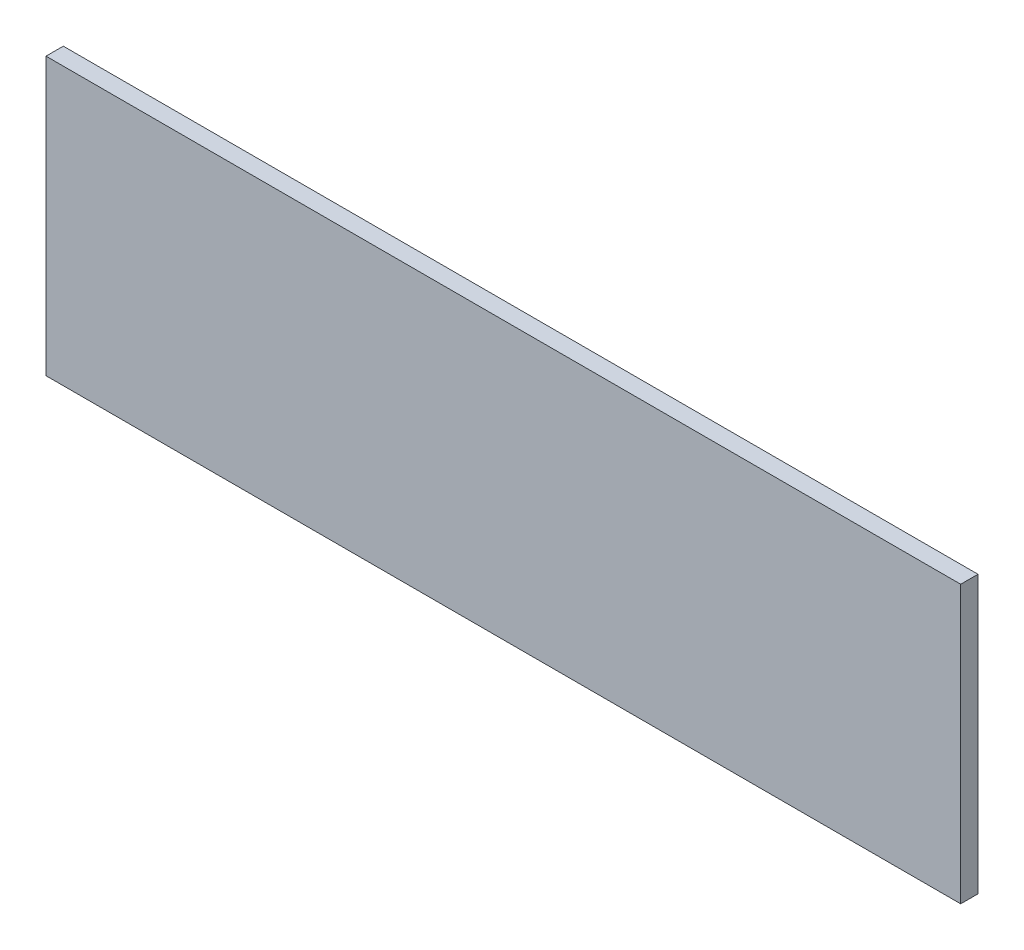
ISO-10303-21;
HEADER;
FILE_DESCRIPTION(('STEP AP214'),'2;1');
FILE_NAME('part.step','',(''),(''),'','','');
FILE_SCHEMA(('AUTOMOTIVE_DESIGN { 1 0 10303 214 1 1 1 1 }'));
ENDSEC;
DATA;
#1=APPLICATION_CONTEXT('core data for automotive mechanical design processes');
#2=APPLICATION_PROTOCOL_DEFINITION('international standard','automotive_design',2000,#1);
#3=PRODUCT_CONTEXT('',#1,'mechanical');
#4=PRODUCT('Part','Part','',(#3));
#5=PRODUCT_RELATED_PRODUCT_CATEGORY('part','',(#4));
#6=PRODUCT_DEFINITION_FORMATION('','',#4);
#7=PRODUCT_DEFINITION_CONTEXT('part definition',#1,'design');
#8=PRODUCT_DEFINITION('design','',#6,#7);
#9=PRODUCT_DEFINITION_SHAPE('','',#8);
#10=(LENGTH_UNIT() NAMED_UNIT(*) SI_UNIT(.MILLI.,.METRE.));
#11=(NAMED_UNIT(*) PLANE_ANGLE_UNIT() SI_UNIT($,.RADIAN.));
#12=(NAMED_UNIT(*) SI_UNIT($,.STERADIAN.) SOLID_ANGLE_UNIT());
#13=UNCERTAINTY_MEASURE_WITH_UNIT(LENGTH_MEASURE(1.E-05),#10,'distance_accuracy_value','');
#14=(GEOMETRIC_REPRESENTATION_CONTEXT(3) GLOBAL_UNCERTAINTY_ASSIGNED_CONTEXT((#13)) GLOBAL_UNIT_ASSIGNED_CONTEXT((#10,
#11,#12)) REPRESENTATION_CONTEXT('',''));
#15=CARTESIAN_POINT('',(0.,0.,0.));
#16=DIRECTION('',(0.,0.,1.));
#17=DIRECTION('',(1.,0.,0.));
#18=AXIS2_PLACEMENT_3D('',#15,#16,#17);
#19=CARTESIAN_POINT('',(335.75625,0.,12.7));
#20=DIRECTION('',(1.,0.,0.));
#21=DIRECTION('',(0.,1.,0.));
#22=AXIS2_PLACEMENT_3D('',#19,#20,#21);
#23=PLANE('',#22);
#24=DIRECTION('',(0.,-1.,0.));
#25=VECTOR('',#24,1.);
#26=CARTESIAN_POINT('',(335.75625,0.,0.));
#27=LINE('',#26,#25);
#28=CARTESIAN_POINT('',(335.75625,-95.25,0.));
#29=VERTEX_POINT('',#28);
#30=CARTESIAN_POINT('',(335.75625,-298.45,0.));
#31=VERTEX_POINT('',#30);
#32=EDGE_CURVE('E95',#29,#31,#27,.T.);
#33=ORIENTED_EDGE('',*,*,#32,.F.);
#34=DIRECTION('',(0.,0.,-1.));
#35=VECTOR('',#34,1.);
#36=CARTESIAN_POINT('',(335.75625,-95.25,12.7));
#37=LINE('',#36,#35);
#38=CARTESIAN_POINT('',(335.75625,-95.25,12.7));
#39=VERTEX_POINT('',#38);
#40=EDGE_CURVE('E11',#39,#29,#37,.T.);
#41=ORIENTED_EDGE('',*,*,#40,.F.);
#42=DIRECTION('',(0.,-1.,0.));
#43=VECTOR('',#42,1.);
#44=CARTESIAN_POINT('',(335.75625,0.,12.7));
#45=LINE('',#44,#43);
#46=CARTESIAN_POINT('',(335.75625,-298.45,12.7));
#47=VERTEX_POINT('',#46);
#48=EDGE_CURVE('E89',#39,#47,#45,.T.);
#49=ORIENTED_EDGE('',*,*,#48,.T.);
#50=DIRECTION('',(0.,0.,-1.));
#51=VECTOR('',#50,1.);
#52=CARTESIAN_POINT('',(335.75625,-298.45,12.7));
#53=LINE('',#52,#51);
#54=EDGE_CURVE('E70',#47,#31,#53,.T.);
#55=ORIENTED_EDGE('',*,*,#54,.T.);
#56=EDGE_LOOP('',(#33,#41,#49,#55));
#57=FACE_BOUND('',#56,.T.);
#58=ADVANCED_FACE('F32',(#57),#23,.T.);
#59=CARTESIAN_POINT('',(0.,-95.25,12.7));
#60=DIRECTION('',(0.,1.,0.));
#61=DIRECTION('',(0.,0.,1.));
#62=AXIS2_PLACEMENT_3D('',#59,#60,#61);
#63=PLANE('',#62);
#64=DIRECTION('',(1.,0.,0.));
#65=VECTOR('',#64,1.);
#66=CARTESIAN_POINT('',(0.,-95.25,0.));
#67=LINE('',#66,#65);
#68=CARTESIAN_POINT('',(-335.75625,-95.25,0.));
#69=VERTEX_POINT('',#68);
#70=EDGE_CURVE('E83',#69,#29,#67,.T.);
#71=ORIENTED_EDGE('',*,*,#70,.F.);
#72=DIRECTION('',(0.,0.,-1.));
#73=VECTOR('',#72,1.);
#74=CARTESIAN_POINT('',(-335.75625,-95.25,12.7));
#75=LINE('',#74,#73);
#76=CARTESIAN_POINT('',(-335.75625,-95.25,12.7));
#77=VERTEX_POINT('',#76);
#78=EDGE_CURVE('E40',#77,#69,#75,.T.);
#79=ORIENTED_EDGE('',*,*,#78,.F.);
#80=DIRECTION('',(1.,0.,0.));
#81=VECTOR('',#80,1.);
#82=CARTESIAN_POINT('',(0.,-95.25,12.7));
#83=LINE('',#82,#81);
#84=EDGE_CURVE('E81',#77,#39,#83,.T.);
#85=ORIENTED_EDGE('',*,*,#84,.T.);
#86=ORIENTED_EDGE('',*,*,#40,.T.);
#87=EDGE_LOOP('',(#71,#79,#85,#86));
#88=FACE_BOUND('',#87,.T.);
#89=ADVANCED_FACE('F79',(#88),#63,.T.);
#90=CARTESIAN_POINT('',(-335.75625,0.,12.7));
#91=DIRECTION('',(1.,0.,0.));
#92=DIRECTION('',(0.,0.,-1.));
#93=AXIS2_PLACEMENT_3D('',#90,#91,#92);
#94=PLANE('',#93);
#95=DIRECTION('',(0.,-1.,0.));
#96=VECTOR('',#95,1.);
#97=CARTESIAN_POINT('',(-335.75625,0.,0.));
#98=LINE('',#97,#96);
#99=CARTESIAN_POINT('',(-335.75625,-298.45,0.));
#100=VERTEX_POINT('',#99);
#101=EDGE_CURVE('E63',#69,#100,#98,.T.);
#102=ORIENTED_EDGE('',*,*,#101,.T.);
#103=DIRECTION('',(0.,0.,-1.));
#104=VECTOR('',#103,1.);
#105=CARTESIAN_POINT('',(-335.75625,-298.45,12.7));
#106=LINE('',#105,#104);
#107=CARTESIAN_POINT('',(-335.75625,-298.45,12.7));
#108=VERTEX_POINT('',#107);
#109=EDGE_CURVE('E84',#108,#100,#106,.T.);
#110=ORIENTED_EDGE('',*,*,#109,.F.);
#111=DIRECTION('',(0.,-1.,0.));
#112=VECTOR('',#111,1.);
#113=CARTESIAN_POINT('',(-335.75625,0.,12.7));
#114=LINE('',#113,#112);
#115=EDGE_CURVE('E85',#77,#108,#114,.T.);
#116=ORIENTED_EDGE('',*,*,#115,.F.);
#117=ORIENTED_EDGE('',*,*,#78,.T.);
#118=EDGE_LOOP('',(#102,#110,#116,#117));
#119=FACE_BOUND('',#118,.T.);
#120=ADVANCED_FACE('F86',(#119),#94,.F.);
#121=CARTESIAN_POINT('',(0.,-298.45,12.7));
#122=DIRECTION('',(0.,1.,0.));
#123=DIRECTION('',(0.,0.,1.));
#124=AXIS2_PLACEMENT_3D('',#121,#122,#123);
#125=PLANE('',#124);
#126=DIRECTION('',(1.,0.,0.));
#127=VECTOR('',#126,1.);
#128=CARTESIAN_POINT('',(0.,-298.45,0.));
#129=LINE('',#128,#127);
#130=EDGE_CURVE('E91',#100,#31,#129,.T.);
#131=ORIENTED_EDGE('',*,*,#130,.T.);
#132=ORIENTED_EDGE('',*,*,#54,.F.);
#133=DIRECTION('',(1.,0.,0.));
#134=VECTOR('',#133,1.);
#135=CARTESIAN_POINT('',(0.,-298.45,12.7));
#136=LINE('',#135,#134);
#137=EDGE_CURVE('E48',#108,#47,#136,.T.);
#138=ORIENTED_EDGE('',*,*,#137,.F.);
#139=ORIENTED_EDGE('',*,*,#109,.T.);
#140=EDGE_LOOP('',(#131,#132,#138,#139));
#141=FACE_BOUND('',#140,.T.);
#142=ADVANCED_FACE('F104',(#141),#125,.F.);
#143=CARTESIAN_POINT('',(0.,0.,12.7));
#144=DIRECTION('',(0.,0.,1.));
#145=DIRECTION('',(1.,0.,0.));
#146=AXIS2_PLACEMENT_3D('',#143,#144,#145);
#147=PLANE('',#146);
#148=ORIENTED_EDGE('',*,*,#48,.F.);
#149=ORIENTED_EDGE('',*,*,#84,.F.);
#150=ORIENTED_EDGE('',*,*,#115,.T.);
#151=ORIENTED_EDGE('',*,*,#137,.T.);
#152=EDGE_LOOP('',(#148,#149,#150,#151));
#153=FACE_BOUND('',#152,.T.);
#154=ADVANCED_FACE('F88',(#153),#147,.T.);
#155=CARTESIAN_POINT('',(0.,0.,0.));
#156=DIRECTION('',(0.,0.,1.));
#157=DIRECTION('',(1.,0.,0.));
#158=AXIS2_PLACEMENT_3D('',#155,#156,#157);
#159=PLANE('',#158);
#160=ORIENTED_EDGE('',*,*,#32,.T.);
#161=ORIENTED_EDGE('',*,*,#130,.F.);
#162=ORIENTED_EDGE('',*,*,#101,.F.);
#163=ORIENTED_EDGE('',*,*,#70,.T.);
#164=EDGE_LOOP('',(#160,#161,#162,#163));
#165=FACE_BOUND('',#164,.T.);
#166=ADVANCED_FACE('F106',(#165),#159,.F.);
#167=CLOSED_SHELL('',(#58,#89,#120,#142,#154,#166));
#168=MANIFOLD_SOLID_BREP('B2',#167);
#169=ADVANCED_BREP_SHAPE_REPRESENTATION('',(#18,#168),#14);
#170=SHAPE_DEFINITION_REPRESENTATION(#9,#169);
ENDSEC;
END-ISO-10303-21;
